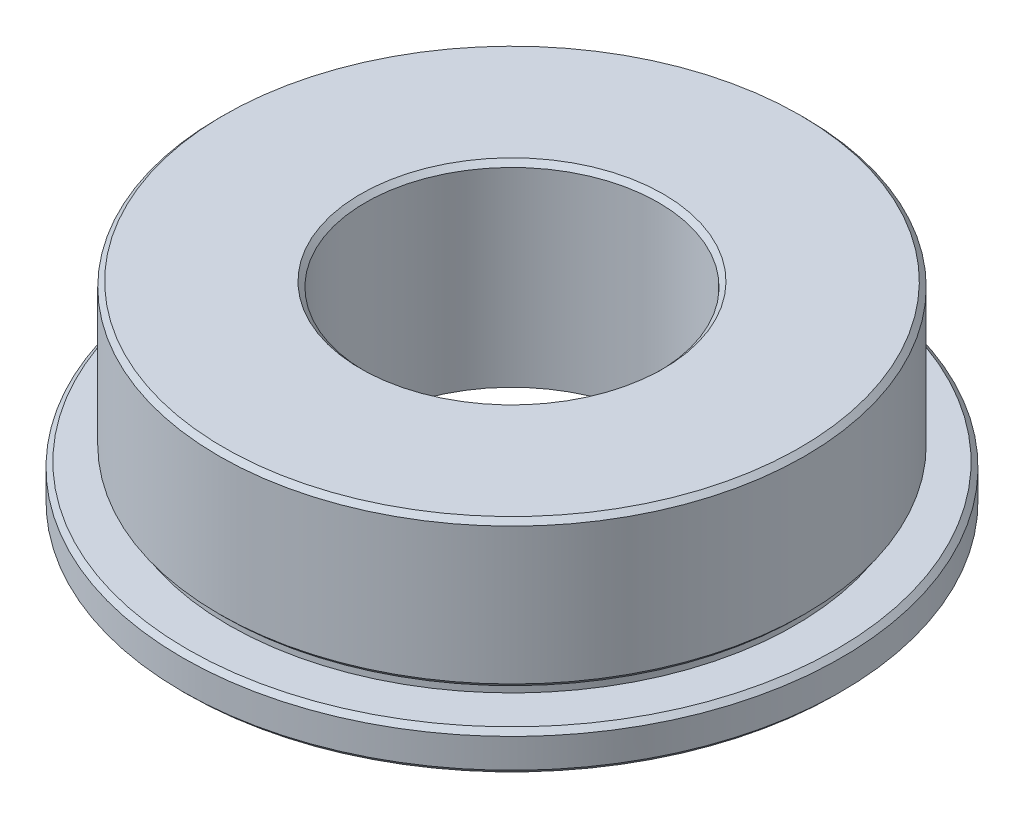
ISO-10303-21;
HEADER;
FILE_DESCRIPTION(('STEP AP214'),'2;1');
FILE_NAME('part.step','',(''),(''),'','','');
FILE_SCHEMA(('AUTOMOTIVE_DESIGN { 1 0 10303 214 1 1 1 1 }'));
ENDSEC;
DATA;
#1=APPLICATION_CONTEXT('core data for automotive mechanical design processes');
#2=APPLICATION_PROTOCOL_DEFINITION('international standard','automotive_design',2000,#1);
#3=PRODUCT_CONTEXT('',#1,'mechanical');
#4=PRODUCT('Part','Part','',(#3));
#5=PRODUCT_RELATED_PRODUCT_CATEGORY('part','',(#4));
#6=PRODUCT_DEFINITION_FORMATION('','',#4);
#7=PRODUCT_DEFINITION_CONTEXT('part definition',#1,'design');
#8=PRODUCT_DEFINITION('design','',#6,#7);
#9=PRODUCT_DEFINITION_SHAPE('','',#8);
#10=(LENGTH_UNIT() NAMED_UNIT(*) SI_UNIT(.MILLI.,.METRE.));
#11=(NAMED_UNIT(*) PLANE_ANGLE_UNIT() SI_UNIT($,.RADIAN.));
#12=(NAMED_UNIT(*) SI_UNIT($,.STERADIAN.) SOLID_ANGLE_UNIT());
#13=UNCERTAINTY_MEASURE_WITH_UNIT(LENGTH_MEASURE(1.E-05),#10,'distance_accuracy_value','');
#14=(GEOMETRIC_REPRESENTATION_CONTEXT(3) GLOBAL_UNCERTAINTY_ASSIGNED_CONTEXT((#13)) GLOBAL_UNIT_ASSIGNED_CONTEXT((#10,
#11,#12)) REPRESENTATION_CONTEXT('',''));
#15=CARTESIAN_POINT('',(0.,0.,0.));
#16=DIRECTION('',(0.,0.,1.));
#17=DIRECTION('',(1.,0.,0.));
#18=AXIS2_PLACEMENT_3D('',#15,#16,#17);
#19=CARTESIAN_POINT('',(3.,0.,0.));
#20=DIRECTION('',(0.,1.,0.));
#21=DIRECTION('',(0.,0.,1.));
#22=AXIS2_PLACEMENT_3D('',#19,#20,#21);
#23=PLANE('',#22);
#24=CARTESIAN_POINT('',(0.,0.,0.));
#25=DIRECTION('',(0.,1.,0.));
#26=DIRECTION('',(0.,0.,1.));
#27=AXIS2_PLACEMENT_3D('',#24,#25,#26);
#28=CIRCLE('',#27,6.65);
#29=CARTESIAN_POINT('',(0.,0.,6.65));
#30=VERTEX_POINT('',#29);
#31=EDGE_CURVE('E68',#30,#30,#28,.F.);
#32=ORIENTED_EDGE('',*,*,#31,.T.);
#33=EDGE_LOOP('',(#32));
#34=FACE_BOUND('',#33,.T.);
#35=CARTESIAN_POINT('',(0.,0.,0.));
#36=DIRECTION('',(0.,1.,0.));
#37=DIRECTION('',(0.,0.,1.));
#38=AXIS2_PLACEMENT_3D('',#35,#36,#37);
#39=CIRCLE('',#38,3.);
#40=CARTESIAN_POINT('',(0.,0.,3.));
#41=VERTEX_POINT('',#40);
#42=EDGE_CURVE('E86',#41,#41,#39,.T.);
#43=ORIENTED_EDGE('',*,*,#42,.T.);
#44=EDGE_LOOP('',(#43));
#45=FACE_BOUND('',#44,.T.);
#46=ADVANCED_FACE('F41',(#34,#45),#23,.F.);
#47=CARTESIAN_POINT('',(0.,4.,0.));
#48=DIRECTION('',(0.,1.,0.));
#49=DIRECTION('',(0.,0.,1.));
#50=AXIS2_PLACEMENT_3D('',#47,#48,#49);
#51=CYLINDRICAL_SURFACE('',#50,6.75);
#52=CARTESIAN_POINT('',(0.,0.700000000000001,0.));
#53=DIRECTION('',(0.,-1.,0.));
#54=DIRECTION('',(0.,0.,-1.));
#55=AXIS2_PLACEMENT_3D('',#52,#53,#54);
#56=CIRCLE('',#55,6.75);
#57=CARTESIAN_POINT('',(0.,0.700000000000001,-6.75));
#58=VERTEX_POINT('',#57);
#59=EDGE_CURVE('E71',#58,#58,#56,.T.);
#60=ORIENTED_EDGE('',*,*,#59,.T.);
#61=EDGE_LOOP('',(#60));
#62=FACE_BOUND('',#61,.T.);
#63=CARTESIAN_POINT('',(0.,0.100000000000003,0.));
#64=DIRECTION('',(0.,1.,0.));
#65=DIRECTION('',(0.,0.,1.));
#66=AXIS2_PLACEMENT_3D('',#63,#64,#65);
#67=CIRCLE('',#66,6.75);
#68=CARTESIAN_POINT('',(0.,0.100000000000003,6.75));
#69=VERTEX_POINT('',#68);
#70=EDGE_CURVE('E74',#69,#69,#67,.T.);
#71=ORIENTED_EDGE('',*,*,#70,.T.);
#72=EDGE_LOOP('',(#71));
#73=FACE_BOUND('',#72,.T.);
#74=ADVANCED_FACE('F108',(#62,#73),#51,.T.);
#75=CARTESIAN_POINT('',(6.75,0.8,0.));
#76=DIRECTION('',(0.,-1.,0.));
#77=DIRECTION('',(0.,0.,-1.));
#78=AXIS2_PLACEMENT_3D('',#75,#76,#77);
#79=PLANE('',#78);
#80=CARTESIAN_POINT('',(0.,0.8,0.));
#81=DIRECTION('',(0.,-1.,0.));
#82=DIRECTION('',(0.,0.,-1.));
#83=AXIS2_PLACEMENT_3D('',#80,#81,#82);
#84=CIRCLE('',#83,6.65);
#85=CARTESIAN_POINT('',(0.,0.8,-6.65));
#86=VERTEX_POINT('',#85);
#87=EDGE_CURVE('E77',#86,#86,#84,.F.);
#88=ORIENTED_EDGE('',*,*,#87,.T.);
#89=EDGE_LOOP('',(#88));
#90=FACE_BOUND('',#89,.T.);
#91=CARTESIAN_POINT('',(0.,0.8,0.));
#92=DIRECTION('',(0.,1.,0.));
#93=DIRECTION('',(0.,0.,1.));
#94=AXIS2_PLACEMENT_3D('',#91,#92,#93);
#95=CIRCLE('',#94,5.8);
#96=CARTESIAN_POINT('',(0.,0.8,5.8));
#97=VERTEX_POINT('',#96);
#98=EDGE_CURVE('E80',#97,#97,#95,.T.);
#99=ORIENTED_EDGE('',*,*,#98,.F.);
#100=EDGE_LOOP('',(#99));
#101=FACE_BOUND('',#100,.T.);
#102=ADVANCED_FACE('F115',(#90,#101),#79,.F.);
#103=CARTESIAN_POINT('',(0.,4.,0.));
#104=DIRECTION('',(0.,1.,0.));
#105=DIRECTION('',(0.,0.,1.));
#106=AXIS2_PLACEMENT_3D('',#103,#104,#105);
#107=CYLINDRICAL_SURFACE('',#106,5.8);
#108=CARTESIAN_POINT('',(0.,1.,0.));
#109=DIRECTION('',(0.,1.,0.));
#110=DIRECTION('',(0.,0.,1.));
#111=AXIS2_PLACEMENT_3D('',#108,#109,#110);
#112=CIRCLE('',#111,5.8);
#113=CARTESIAN_POINT('',(0.,1.,5.8));
#114=VERTEX_POINT('',#113);
#115=EDGE_CURVE('E83',#114,#114,#112,.T.);
#116=ORIENTED_EDGE('',*,*,#115,.F.);
#117=EDGE_LOOP('',(#116));
#118=FACE_BOUND('',#117,.T.);
#119=ORIENTED_EDGE('',*,*,#98,.T.);
#120=EDGE_LOOP('',(#119));
#121=FACE_BOUND('',#120,.T.);
#122=ADVANCED_FACE('F159',(#118,#121),#107,.T.);
#123=CARTESIAN_POINT('',(5.8,1.,0.));
#124=DIRECTION('',(0.,1.,0.));
#125=DIRECTION('',(0.,0.,1.));
#126=AXIS2_PLACEMENT_3D('',#123,#124,#125);
#127=PLANE('',#126);
#128=CARTESIAN_POINT('',(0.,1.,0.));
#129=DIRECTION('',(0.,1.,0.));
#130=DIRECTION('',(0.,0.,1.));
#131=AXIS2_PLACEMENT_3D('',#128,#129,#130);
#132=CIRCLE('',#131,5.9);
#133=CARTESIAN_POINT('',(0.,1.,5.9));
#134=VERTEX_POINT('',#133);
#135=EDGE_CURVE('E10',#134,#134,#132,.F.);
#136=ORIENTED_EDGE('',*,*,#135,.T.);
#137=EDGE_LOOP('',(#136));
#138=FACE_BOUND('',#137,.T.);
#139=ORIENTED_EDGE('',*,*,#115,.T.);
#140=EDGE_LOOP('',(#139));
#141=FACE_BOUND('',#140,.T.);
#142=ADVANCED_FACE('F154',(#138,#141),#127,.F.);
#143=CARTESIAN_POINT('',(0.,4.,0.));
#144=DIRECTION('',(0.,1.,0.));
#145=DIRECTION('',(0.,0.,1.));
#146=AXIS2_PLACEMENT_3D('',#143,#144,#145);
#147=CYLINDRICAL_SURFACE('',#146,6.);
#148=CARTESIAN_POINT('',(0.,3.9,0.));
#149=DIRECTION('',(0.,-1.,0.));
#150=DIRECTION('',(0.,0.,-1.));
#151=AXIS2_PLACEMENT_3D('',#148,#149,#150);
#152=CIRCLE('',#151,6.);
#153=CARTESIAN_POINT('',(0.,3.9,-6.));
#154=VERTEX_POINT('',#153);
#155=EDGE_CURVE('E49',#154,#154,#152,.T.);
#156=ORIENTED_EDGE('',*,*,#155,.T.);
#157=EDGE_LOOP('',(#156));
#158=FACE_BOUND('',#157,.T.);
#159=CARTESIAN_POINT('',(0.,1.09999999999999,0.));
#160=DIRECTION('',(0.,1.,0.));
#161=DIRECTION('',(0.,0.,1.));
#162=AXIS2_PLACEMENT_3D('',#159,#160,#161);
#163=CIRCLE('',#162,6.);
#164=CARTESIAN_POINT('',(0.,1.09999999999999,6.));
#165=VERTEX_POINT('',#164);
#166=EDGE_CURVE('E53',#165,#165,#163,.T.);
#167=ORIENTED_EDGE('',*,*,#166,.T.);
#168=EDGE_LOOP('',(#167));
#169=FACE_BOUND('',#168,.T.);
#170=ADVANCED_FACE('F104',(#158,#169),#147,.T.);
#171=CARTESIAN_POINT('',(6.,4.,0.));
#172=DIRECTION('',(0.,-1.,0.));
#173=DIRECTION('',(0.,0.,-1.));
#174=AXIS2_PLACEMENT_3D('',#171,#172,#173);
#175=PLANE('',#174);
#176=CARTESIAN_POINT('',(0.,4.,0.));
#177=DIRECTION('',(0.,-1.,0.));
#178=DIRECTION('',(0.,0.,-1.));
#179=AXIS2_PLACEMENT_3D('',#176,#177,#178);
#180=CIRCLE('',#179,3.1);
#181=CARTESIAN_POINT('',(0.,4.,-3.1));
#182=VERTEX_POINT('',#181);
#183=EDGE_CURVE('E57',#182,#182,#180,.T.);
#184=ORIENTED_EDGE('',*,*,#183,.T.);
#185=EDGE_LOOP('',(#184));
#186=FACE_BOUND('',#185,.T.);
#187=CARTESIAN_POINT('',(0.,4.,0.));
#188=DIRECTION('',(0.,-1.,0.));
#189=DIRECTION('',(0.,0.,-1.));
#190=AXIS2_PLACEMENT_3D('',#187,#188,#189);
#191=CIRCLE('',#190,5.9);
#192=CARTESIAN_POINT('',(0.,4.,-5.9));
#193=VERTEX_POINT('',#192);
#194=EDGE_CURVE('E62',#193,#193,#191,.F.);
#195=ORIENTED_EDGE('',*,*,#194,.T.);
#196=EDGE_LOOP('',(#195));
#197=FACE_BOUND('',#196,.T.);
#198=ADVANCED_FACE('F94',(#186,#197),#175,.F.);
#199=CARTESIAN_POINT('',(0.,4.,0.));
#200=DIRECTION('',(0.,1.,0.));
#201=DIRECTION('',(0.,0.,1.));
#202=AXIS2_PLACEMENT_3D('',#199,#200,#201);
#203=CYLINDRICAL_SURFACE('',#202,3.);
#204=CARTESIAN_POINT('',(0.,3.9,0.));
#205=DIRECTION('',(0.,-1.,0.));
#206=DIRECTION('',(0.,0.,-1.));
#207=AXIS2_PLACEMENT_3D('',#204,#205,#206);
#208=CIRCLE('',#207,3.);
#209=CARTESIAN_POINT('',(0.,3.9,-3.));
#210=VERTEX_POINT('',#209);
#211=EDGE_CURVE('E65',#210,#210,#208,.F.);
#212=ORIENTED_EDGE('',*,*,#211,.T.);
#213=EDGE_LOOP('',(#212));
#214=FACE_BOUND('',#213,.T.);
#215=ORIENTED_EDGE('',*,*,#42,.F.);
#216=EDGE_LOOP('',(#215));
#217=FACE_BOUND('',#216,.T.);
#218=ADVANCED_FACE('F91',(#214,#217),#203,.F.);
#219=CARTESIAN_POINT('',(0.,0.8,0.));
#220=DIRECTION('',(0.,-1.,0.));
#221=DIRECTION('',(0.,0.,-1.));
#222=AXIS2_PLACEMENT_3D('',#219,#220,#221);
#223=CONICAL_SURFACE('',#222,6.65,0.785398163397435);
#224=ORIENTED_EDGE('',*,*,#59,.F.);
#225=EDGE_LOOP('',(#224));
#226=FACE_BOUND('',#225,.T.);
#227=ORIENTED_EDGE('',*,*,#87,.F.);
#228=EDGE_LOOP('',(#227));
#229=FACE_BOUND('',#228,.T.);
#230=ADVANCED_FACE('F93',(#226,#229),#223,.T.);
#231=CARTESIAN_POINT('',(0.,0.100000000000003,0.));
#232=DIRECTION('',(0.,1.,0.));
#233=DIRECTION('',(0.,0.,1.));
#234=AXIS2_PLACEMENT_3D('',#231,#232,#233);
#235=CONICAL_SURFACE('',#234,6.75,0.785398163397444);
#236=ORIENTED_EDGE('',*,*,#31,.F.);
#237=EDGE_LOOP('',(#236));
#238=FACE_BOUND('',#237,.T.);
#239=ORIENTED_EDGE('',*,*,#70,.F.);
#240=EDGE_LOOP('',(#239));
#241=FACE_BOUND('',#240,.T.);
#242=ADVANCED_FACE('F101',(#238,#241),#235,.T.);
#243=CARTESIAN_POINT('',(0.,3.9,0.));
#244=DIRECTION('',(0.,1.,0.));
#245=DIRECTION('',(0.,0.,1.));
#246=AXIS2_PLACEMENT_3D('',#243,#244,#245);
#247=CONICAL_SURFACE('',#246,3.,0.785398163397444);
#248=ORIENTED_EDGE('',*,*,#183,.F.);
#249=EDGE_LOOP('',(#248));
#250=FACE_BOUND('',#249,.T.);
#251=ORIENTED_EDGE('',*,*,#211,.F.);
#252=EDGE_LOOP('',(#251));
#253=FACE_BOUND('',#252,.T.);
#254=ADVANCED_FACE('F129',(#250,#253),#247,.F.);
#255=CARTESIAN_POINT('',(0.,4.,0.));
#256=DIRECTION('',(0.,-1.,0.));
#257=DIRECTION('',(0.,0.,-1.));
#258=AXIS2_PLACEMENT_3D('',#255,#256,#257);
#259=CONICAL_SURFACE('',#258,5.9,0.785398163397435);
#260=ORIENTED_EDGE('',*,*,#155,.F.);
#261=EDGE_LOOP('',(#260));
#262=FACE_BOUND('',#261,.T.);
#263=ORIENTED_EDGE('',*,*,#194,.F.);
#264=EDGE_LOOP('',(#263));
#265=FACE_BOUND('',#264,.T.);
#266=ADVANCED_FACE('F135',(#262,#265),#259,.T.);
#267=CARTESIAN_POINT('',(0.,1.09999999999999,0.));
#268=DIRECTION('',(0.,1.,0.));
#269=DIRECTION('',(0.,0.,1.));
#270=AXIS2_PLACEMENT_3D('',#267,#268,#269);
#271=CONICAL_SURFACE('',#270,6.,0.785398163397453);
#272=ORIENTED_EDGE('',*,*,#135,.F.);
#273=EDGE_LOOP('',(#272));
#274=FACE_BOUND('',#273,.T.);
#275=ORIENTED_EDGE('',*,*,#166,.F.);
#276=EDGE_LOOP('',(#275));
#277=FACE_BOUND('',#276,.T.);
#278=ADVANCED_FACE('F44',(#274,#277),#271,.T.);
#279=CLOSED_SHELL('',(#46,#74,#102,#122,#142,#170,#198,#218,#230,#242,#254,#266,#278));
#280=MANIFOLD_SOLID_BREP('B2',#279);
#281=ADVANCED_BREP_SHAPE_REPRESENTATION('',(#18,#280),#14);
#282=SHAPE_DEFINITION_REPRESENTATION(#9,#281);
ENDSEC;
END-ISO-10303-21;
